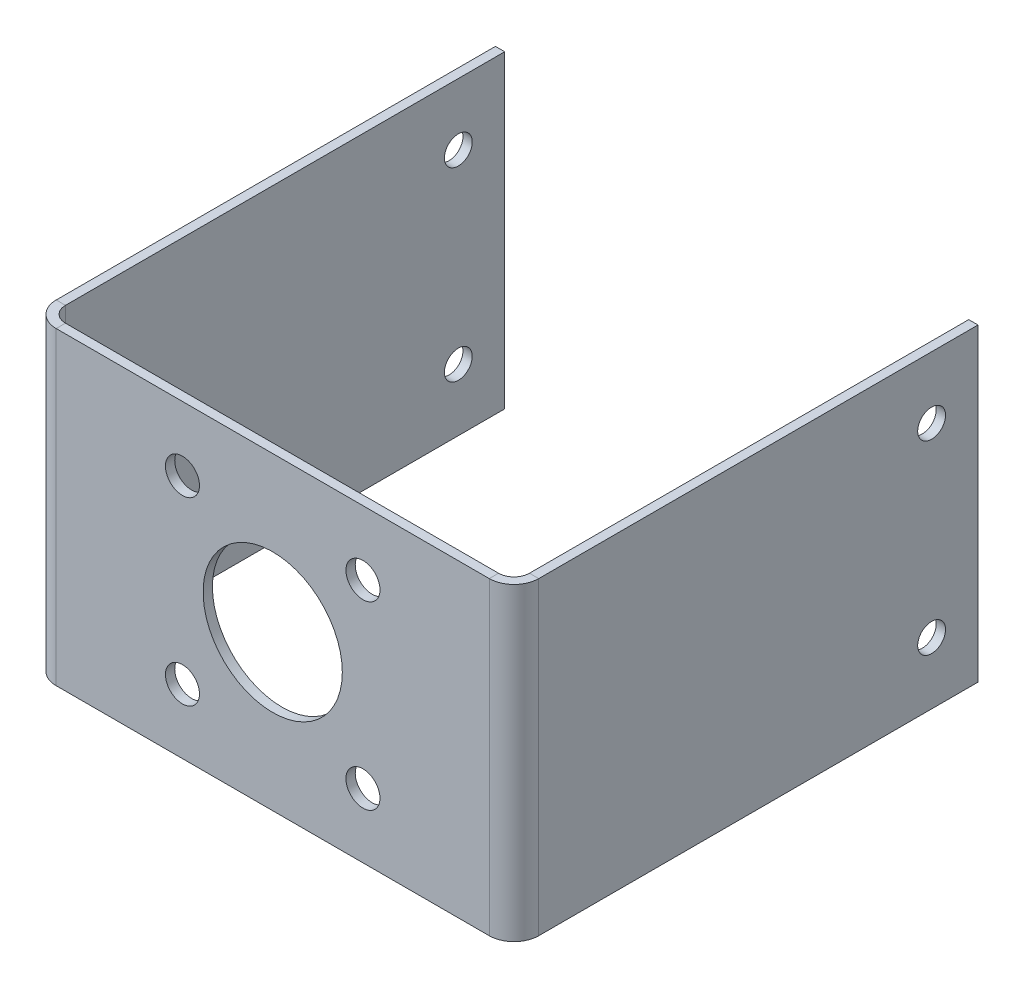
ISO-10303-21;
HEADER;
FILE_DESCRIPTION(('STEP AP214'),'2;1');
FILE_NAME('part.step','',(''),(''),'','','');
FILE_SCHEMA(('AUTOMOTIVE_DESIGN { 1 0 10303 214 1 1 1 1 }'));
ENDSEC;
DATA;
#1=APPLICATION_CONTEXT('core data for automotive mechanical design processes');
#2=APPLICATION_PROTOCOL_DEFINITION('international standard','automotive_design',2000,#1);
#3=PRODUCT_CONTEXT('',#1,'mechanical');
#4=PRODUCT('Part','Part','',(#3));
#5=PRODUCT_RELATED_PRODUCT_CATEGORY('part','',(#4));
#6=PRODUCT_DEFINITION_FORMATION('','',#4);
#7=PRODUCT_DEFINITION_CONTEXT('part definition',#1,'design');
#8=PRODUCT_DEFINITION('design','',#6,#7);
#9=PRODUCT_DEFINITION_SHAPE('','',#8);
#10=(LENGTH_UNIT() NAMED_UNIT(*) SI_UNIT(.MILLI.,.METRE.));
#11=(NAMED_UNIT(*) PLANE_ANGLE_UNIT() SI_UNIT($,.RADIAN.));
#12=(NAMED_UNIT(*) SI_UNIT($,.STERADIAN.) SOLID_ANGLE_UNIT());
#13=UNCERTAINTY_MEASURE_WITH_UNIT(LENGTH_MEASURE(1.E-05),#10,'distance_accuracy_value','');
#14=(GEOMETRIC_REPRESENTATION_CONTEXT(3) GLOBAL_UNCERTAINTY_ASSIGNED_CONTEXT((#13)) GLOBAL_UNIT_ASSIGNED_CONTEXT((#10,
#11,#12)) REPRESENTATION_CONTEXT('',''));
#15=CARTESIAN_POINT('',(0.,0.,0.));
#16=DIRECTION('',(0.,0.,1.));
#17=DIRECTION('',(1.,0.,0.));
#18=AXIS2_PLACEMENT_3D('',#15,#16,#17);
#19=CARTESIAN_POINT('',(0.,0.,-6.00000000000001));
#20=DIRECTION('',(0.,0.,-1.));
#21=DIRECTION('',(-1.,0.,0.));
#22=AXIS2_PLACEMENT_3D('',#19,#20,#21);
#23=PLANE('',#22);
#24=CARTESIAN_POINT('',(-58.3500000000002,58.3500000000005,-6.00000000000001));
#25=DIRECTION('',(0.,0.,-1.));
#26=DIRECTION('',(-1.,0.,0.));
#27=AXIS2_PLACEMENT_3D('',#24,#25,#26);
#28=CIRCLE('',#27,11.);
#29=CARTESIAN_POINT('',(-69.3500000000002,58.3500000000005,-6.00000000000001));
#30=VERTEX_POINT('',#29);
#31=EDGE_CURVE('E348',#30,#30,#28,.T.);
#32=ORIENTED_EDGE('',*,*,#31,.F.);
#33=EDGE_LOOP('',(#32));
#34=FACE_BOUND('',#33,.T.);
#35=CARTESIAN_POINT('',(-58.3500000000003,-58.35,-6.000000000002));
#36=DIRECTION('',(0.,0.,-1.));
#37=DIRECTION('',(-1.,0.,0.));
#38=AXIS2_PLACEMENT_3D('',#35,#36,#37);
#39=CIRCLE('',#38,11.);
#40=CARTESIAN_POINT('',(-69.3500000000003,-58.35,-6.000000000002));
#41=VERTEX_POINT('',#40);
#42=EDGE_CURVE('E345',#41,#41,#39,.T.);
#43=ORIENTED_EDGE('',*,*,#42,.F.);
#44=EDGE_LOOP('',(#43));
#45=FACE_BOUND('',#44,.T.);
#46=CARTESIAN_POINT('',(58.3500000000003,-58.35,-6.000000000002));
#47=DIRECTION('',(0.,0.,-1.));
#48=DIRECTION('',(-1.,0.,0.));
#49=AXIS2_PLACEMENT_3D('',#46,#47,#48);
#50=CIRCLE('',#49,11.);
#51=CARTESIAN_POINT('',(47.3500000000002,-58.35,-6.000000000002));
#52=VERTEX_POINT('',#51);
#53=EDGE_CURVE('E342',#52,#52,#50,.T.);
#54=ORIENTED_EDGE('',*,*,#53,.F.);
#55=EDGE_LOOP('',(#54));
#56=FACE_BOUND('',#55,.T.);
#57=CARTESIAN_POINT('',(58.3500000000003,58.3500000000005,-6.00000000000001));
#58=DIRECTION('',(0.,0.,-1.));
#59=DIRECTION('',(-1.,0.,0.));
#60=AXIS2_PLACEMENT_3D('',#57,#58,#59);
#61=CIRCLE('',#60,11.);
#62=CARTESIAN_POINT('',(47.3500000000003,58.3500000000005,-6.00000000000001));
#63=VERTEX_POINT('',#62);
#64=EDGE_CURVE('E339',#63,#63,#61,.T.);
#65=ORIENTED_EDGE('',*,*,#64,.F.);
#66=EDGE_LOOP('',(#65));
#67=FACE_BOUND('',#66,.T.);
#68=CARTESIAN_POINT('',(0.,0.,-6.00000000000001));
#69=DIRECTION('',(0.,0.,-1.));
#70=DIRECTION('',(-1.,0.,0.));
#71=AXIS2_PLACEMENT_3D('',#68,#69,#70);
#72=CIRCLE('',#71,45.);
#73=CARTESIAN_POINT('',(-45.0000000000002,0.,-6.00000000000001));
#74=VERTEX_POINT('',#73);
#75=EDGE_CURVE('E224',#74,#74,#72,.T.);
#76=ORIENTED_EDGE('',*,*,#75,.F.);
#77=EDGE_LOOP('',(#76));
#78=FACE_BOUND('',#77,.T.);
#79=DIRECTION('',(-1.,0.,0.));
#80=VECTOR('',#79,1.);
#81=CARTESIAN_POINT('',(-156.000000000001,100.000000000001,-6.00000000000001));
#82=LINE('',#81,#80);
#83=CARTESIAN_POINT('',(140.,100.000000000001,-6.00000000000001));
#84=VERTEX_POINT('',#83);
#85=CARTESIAN_POINT('',(-140.000000000001,100.000000000001,-6.00000000000001));
#86=VERTEX_POINT('',#85);
#87=EDGE_CURVE('E99',#84,#86,#82,.T.);
#88=ORIENTED_EDGE('',*,*,#87,.F.);
#89=DIRECTION('',(0.,-1.,0.));
#90=VECTOR('',#89,1.);
#91=CARTESIAN_POINT('',(140.000000000001,-100.000000000001,-6.000000000002));
#92=LINE('',#91,#90);
#93=CARTESIAN_POINT('',(140.000000000001,-100.,-6.000000000002));
#94=VERTEX_POINT('',#93);
#95=EDGE_CURVE('E237',#94,#84,#92,.F.);
#96=ORIENTED_EDGE('',*,*,#95,.F.);
#97=DIRECTION('',(1.,0.,0.));
#98=VECTOR('',#97,1.);
#99=CARTESIAN_POINT('',(-156.,-100.000000000001,-6.000000000002));
#100=LINE('',#99,#98);
#101=CARTESIAN_POINT('',(-140.,-100.,-6.000000000002));
#102=VERTEX_POINT('',#101);
#103=EDGE_CURVE('E15',#102,#94,#100,.T.);
#104=ORIENTED_EDGE('',*,*,#103,.F.);
#105=DIRECTION('',(0.,1.,0.));
#106=VECTOR('',#105,1.);
#107=CARTESIAN_POINT('',(-140.000000000001,100.000000000001,-6.00000000000001));
#108=LINE('',#107,#106);
#109=EDGE_CURVE('E291',#86,#102,#108,.F.);
#110=ORIENTED_EDGE('',*,*,#109,.F.);
#111=EDGE_LOOP('',(#88,#96,#104,#110));
#112=FACE_BOUND('',#111,.T.);
#113=ADVANCED_FACE('F90',(#34,#45,#56,#67,#78,#112),#23,.T.);
#114=CARTESIAN_POINT('',(0.,0.,0.));
#115=DIRECTION('',(0.,0.,-1.));
#116=DIRECTION('',(-1.,0.,0.));
#117=AXIS2_PLACEMENT_3D('',#114,#115,#116);
#118=PLANE('',#117);
#119=CARTESIAN_POINT('',(-58.3500000000002,58.3500000000005,0.));
#120=DIRECTION('',(0.,0.,1.));
#121=DIRECTION('',(1.,0.,0.));
#122=AXIS2_PLACEMENT_3D('',#119,#120,#121);
#123=CIRCLE('',#122,11.);
#124=CARTESIAN_POINT('',(-47.3500000000002,58.3500000000005,0.));
#125=VERTEX_POINT('',#124);
#126=EDGE_CURVE('E327',#125,#125,#123,.T.);
#127=ORIENTED_EDGE('',*,*,#126,.F.);
#128=EDGE_LOOP('',(#127));
#129=FACE_BOUND('',#128,.T.);
#130=CARTESIAN_POINT('',(-58.3500000000003,-58.35,-1.99840144432528E-12));
#131=DIRECTION('',(0.,0.,1.));
#132=DIRECTION('',(1.,0.,0.));
#133=AXIS2_PLACEMENT_3D('',#130,#131,#132);
#134=CIRCLE('',#133,11.);
#135=CARTESIAN_POINT('',(-47.3500000000002,-58.35,-1.99840144432528E-12));
#136=VERTEX_POINT('',#135);
#137=EDGE_CURVE('E332',#136,#136,#134,.T.);
#138=ORIENTED_EDGE('',*,*,#137,.F.);
#139=EDGE_LOOP('',(#138));
#140=FACE_BOUND('',#139,.T.);
#141=CARTESIAN_POINT('',(58.3500000000003,-58.35,-1.99840144432528E-12));
#142=DIRECTION('',(0.,0.,1.));
#143=DIRECTION('',(1.,0.,0.));
#144=AXIS2_PLACEMENT_3D('',#141,#142,#143);
#145=CIRCLE('',#144,11.);
#146=CARTESIAN_POINT('',(69.3500000000003,-58.35,-1.99840144432528E-12));
#147=VERTEX_POINT('',#146);
#148=EDGE_CURVE('E328',#147,#147,#145,.T.);
#149=ORIENTED_EDGE('',*,*,#148,.F.);
#150=EDGE_LOOP('',(#149));
#151=FACE_BOUND('',#150,.T.);
#152=CARTESIAN_POINT('',(58.3500000000003,58.3500000000005,0.));
#153=DIRECTION('',(0.,0.,1.));
#154=DIRECTION('',(1.,0.,0.));
#155=AXIS2_PLACEMENT_3D('',#152,#153,#154);
#156=CIRCLE('',#155,11.);
#157=CARTESIAN_POINT('',(69.3500000000003,58.3500000000005,0.));
#158=VERTEX_POINT('',#157);
#159=EDGE_CURVE('E331',#158,#158,#156,.T.);
#160=ORIENTED_EDGE('',*,*,#159,.F.);
#161=EDGE_LOOP('',(#160));
#162=FACE_BOUND('',#161,.T.);
#163=CARTESIAN_POINT('',(0.,0.,0.));
#164=DIRECTION('',(0.,0.,1.));
#165=DIRECTION('',(1.,0.,0.));
#166=AXIS2_PLACEMENT_3D('',#163,#164,#165);
#167=CIRCLE('',#166,45.);
#168=CARTESIAN_POINT('',(45.0000000000002,0.,0.));
#169=VERTEX_POINT('',#168);
#170=EDGE_CURVE('E351',#169,#169,#167,.T.);
#171=ORIENTED_EDGE('',*,*,#170,.F.);
#172=EDGE_LOOP('',(#171));
#173=FACE_BOUND('',#172,.T.);
#174=DIRECTION('',(0.,-1.,0.));
#175=VECTOR('',#174,1.);
#176=CARTESIAN_POINT('',(140.000000000001,-100.000000000001,-1.99840144432528E-12));
#177=LINE('',#176,#175);
#178=CARTESIAN_POINT('',(140.000000000001,-100.,-1.99840144432528E-12));
#179=VERTEX_POINT('',#178);
#180=CARTESIAN_POINT('',(140.,100.000000000001,0.));
#181=VERTEX_POINT('',#180);
#182=EDGE_CURVE('E225',#179,#181,#177,.F.);
#183=ORIENTED_EDGE('',*,*,#182,.T.);
#184=DIRECTION('',(-1.,0.,0.));
#185=VECTOR('',#184,1.);
#186=CARTESIAN_POINT('',(-156.000000000001,100.000000000001,0.));
#187=LINE('',#186,#185);
#188=CARTESIAN_POINT('',(-140.000000000001,100.,0.));
#189=VERTEX_POINT('',#188);
#190=EDGE_CURVE('E297',#181,#189,#187,.T.);
#191=ORIENTED_EDGE('',*,*,#190,.T.);
#192=DIRECTION('',(0.,1.,0.));
#193=VECTOR('',#192,1.);
#194=CARTESIAN_POINT('',(-140.000000000001,100.000000000001,0.));
#195=LINE('',#194,#193);
#196=CARTESIAN_POINT('',(-140.,-100.,-1.99840144432528E-12));
#197=VERTEX_POINT('',#196);
#198=EDGE_CURVE('E279',#189,#197,#195,.F.);
#199=ORIENTED_EDGE('',*,*,#198,.T.);
#200=DIRECTION('',(1.,0.,0.));
#201=VECTOR('',#200,1.);
#202=CARTESIAN_POINT('',(-156.,-100.000000000001,-1.99840144432528E-12));
#203=LINE('',#202,#201);
#204=EDGE_CURVE('E299',#197,#179,#203,.T.);
#205=ORIENTED_EDGE('',*,*,#204,.T.);
#206=EDGE_LOOP('',(#183,#191,#199,#205));
#207=FACE_BOUND('',#206,.T.);
#208=ADVANCED_FACE('F381',(#129,#140,#151,#162,#173,#207),#118,.F.);
#209=CARTESIAN_POINT('',(-156.,-100.000000000001,-6.000000000002));
#210=DIRECTION('',(0.,-1.,0.));
#211=DIRECTION('',(0.,0.,-1.));
#212=AXIS2_PLACEMENT_3D('',#209,#210,#211);
#213=PLANE('',#212);
#214=ORIENTED_EDGE('',*,*,#103,.T.);
#215=DIRECTION('',(0.,0.,1.));
#216=VECTOR('',#215,1.);
#217=CARTESIAN_POINT('',(140.000000000001,-100.,-6.000000000002));
#218=LINE('',#217,#216);
#219=EDGE_CURVE('E231',#94,#179,#218,.T.);
#220=ORIENTED_EDGE('',*,*,#219,.T.);
#221=ORIENTED_EDGE('',*,*,#204,.F.);
#222=DIRECTION('',(0.,0.,1.));
#223=VECTOR('',#222,1.);
#224=CARTESIAN_POINT('',(-140.,-100.,-6.000000000002));
#225=LINE('',#224,#223);
#226=EDGE_CURVE('E113',#102,#197,#225,.T.);
#227=ORIENTED_EDGE('',*,*,#226,.F.);
#228=EDGE_LOOP('',(#214,#220,#221,#227));
#229=FACE_BOUND('',#228,.T.);
#230=ADVANCED_FACE('F387',(#229),#213,.T.);
#231=CARTESIAN_POINT('',(-156.000000000001,100.000000000001,-6.00000000000001));
#232=DIRECTION('',(0.,1.,0.));
#233=DIRECTION('',(0.,0.,1.));
#234=AXIS2_PLACEMENT_3D('',#231,#232,#233);
#235=PLANE('',#234);
#236=DIRECTION('',(0.,0.,1.));
#237=VECTOR('',#236,1.);
#238=CARTESIAN_POINT('',(140.,100.000000000001,-6.00000000000001));
#239=LINE('',#238,#237);
#240=EDGE_CURVE('E243',#84,#181,#239,.T.);
#241=ORIENTED_EDGE('',*,*,#240,.F.);
#242=ORIENTED_EDGE('',*,*,#87,.T.);
#243=DIRECTION('',(0.,0.,1.));
#244=VECTOR('',#243,1.);
#245=CARTESIAN_POINT('',(-140.000000000001,100.,-6.00000000000001));
#246=LINE('',#245,#244);
#247=EDGE_CURVE('E285',#86,#189,#246,.T.);
#248=ORIENTED_EDGE('',*,*,#247,.T.);
#249=ORIENTED_EDGE('',*,*,#190,.F.);
#250=EDGE_LOOP('',(#241,#242,#248,#249));
#251=FACE_BOUND('',#250,.T.);
#252=ADVANCED_FACE('F92',(#251),#235,.T.);
#253=CARTESIAN_POINT('',(-140.,-100.,-16.000000000002));
#254=DIRECTION('',(0.,-1.,0.));
#255=DIRECTION('',(0.,0.,-1.));
#256=AXIS2_PLACEMENT_3D('',#253,#254,#255);
#257=PLANE('',#256);
#258=DIRECTION('',(1.,0.,0.));
#259=VECTOR('',#258,1.);
#260=CARTESIAN_POINT('',(-156.,-100.,-16.000000000002));
#261=LINE('',#260,#259);
#262=CARTESIAN_POINT('',(-150.,-100.,-16.000000000002));
#263=VERTEX_POINT('',#262);
#264=CARTESIAN_POINT('',(-156.,-100.,-16.000000000002));
#265=VERTEX_POINT('',#264);
#266=EDGE_CURVE('E246',#263,#265,#261,.F.);
#267=ORIENTED_EDGE('',*,*,#266,.F.);
#268=CARTESIAN_POINT('',(-140.,-100.,-16.000000000002));
#269=DIRECTION('',(0.,1.,0.));
#270=DIRECTION('',(0.,0.,1.));
#271=AXIS2_PLACEMENT_3D('',#268,#269,#270);
#272=CIRCLE('',#271,10.);
#273=EDGE_CURVE('E288',#102,#263,#272,.F.);
#274=ORIENTED_EDGE('',*,*,#273,.F.);
#275=ORIENTED_EDGE('',*,*,#226,.T.);
#276=CARTESIAN_POINT('',(-140.,-100.,-16.000000000002));
#277=DIRECTION('',(0.,1.,0.));
#278=DIRECTION('',(0.,0.,1.));
#279=AXIS2_PLACEMENT_3D('',#276,#277,#278);
#280=CIRCLE('',#279,16.);
#281=EDGE_CURVE('E281',#197,#265,#280,.F.);
#282=ORIENTED_EDGE('',*,*,#281,.T.);
#283=EDGE_LOOP('',(#267,#274,#275,#282));
#284=FACE_BOUND('',#283,.T.);
#285=ADVANCED_FACE('F399',(#284),#257,.T.);
#286=CARTESIAN_POINT('',(-140.000000000001,100.,-16.));
#287=DIRECTION('',(0.,-1.,0.));
#288=DIRECTION('',(0.,0.,-1.));
#289=AXIS2_PLACEMENT_3D('',#286,#287,#288);
#290=PLANE('',#289);
#291=CARTESIAN_POINT('',(-140.000000000001,100.,-16.));
#292=DIRECTION('',(0.,1.,0.));
#293=DIRECTION('',(0.,0.,1.));
#294=AXIS2_PLACEMENT_3D('',#291,#292,#293);
#295=CIRCLE('',#294,10.);
#296=CARTESIAN_POINT('',(-150.000000000001,100.,-16.));
#297=VERTEX_POINT('',#296);
#298=EDGE_CURVE('E252',#297,#86,#295,.T.);
#299=ORIENTED_EDGE('',*,*,#298,.F.);
#300=DIRECTION('',(1.,0.,0.));
#301=VECTOR('',#300,1.);
#302=CARTESIAN_POINT('',(-150.000000000001,100.,-16.));
#303=LINE('',#302,#301);
#304=CARTESIAN_POINT('',(-156.000000000001,100.,-16.));
#305=VERTEX_POINT('',#304);
#306=EDGE_CURVE('E272',#297,#305,#303,.F.);
#307=ORIENTED_EDGE('',*,*,#306,.T.);
#308=CARTESIAN_POINT('',(-140.000000000001,100.,-16.));
#309=DIRECTION('',(0.,1.,0.));
#310=DIRECTION('',(0.,0.,1.));
#311=AXIS2_PLACEMENT_3D('',#308,#309,#310);
#312=CIRCLE('',#311,16.);
#313=EDGE_CURVE('E282',#305,#189,#312,.T.);
#314=ORIENTED_EDGE('',*,*,#313,.T.);
#315=ORIENTED_EDGE('',*,*,#247,.F.);
#316=EDGE_LOOP('',(#299,#307,#314,#315));
#317=FACE_BOUND('',#316,.T.);
#318=ADVANCED_FACE('F393',(#317),#290,.F.);
#319=CARTESIAN_POINT('',(-140.000000000001,100.000000000001,-16.));
#320=DIRECTION('',(0.,1.,0.));
#321=DIRECTION('',(-1.,0.,0.));
#322=AXIS2_PLACEMENT_3D('',#319,#320,#321);
#323=CYLINDRICAL_SURFACE('',#322,16.);
#324=ORIENTED_EDGE('',*,*,#198,.F.);
#325=ORIENTED_EDGE('',*,*,#313,.F.);
#326=DIRECTION('',(0.,1.,0.));
#327=VECTOR('',#326,1.);
#328=CARTESIAN_POINT('',(-156.,-100.,-16.000000000002));
#329=LINE('',#328,#327);
#330=EDGE_CURVE('E270',#305,#265,#329,.F.);
#331=ORIENTED_EDGE('',*,*,#330,.T.);
#332=ORIENTED_EDGE('',*,*,#281,.F.);
#333=EDGE_LOOP('',(#324,#325,#331,#332));
#334=FACE_BOUND('',#333,.T.);
#335=ADVANCED_FACE('F438',(#334),#323,.T.);
#336=CARTESIAN_POINT('',(-140.000000000001,100.000000000001,-16.));
#337=DIRECTION('',(0.,1.,0.));
#338=DIRECTION('',(-1.,0.,0.));
#339=AXIS2_PLACEMENT_3D('',#336,#337,#338);
#340=CYLINDRICAL_SURFACE('',#339,10.);
#341=ORIENTED_EDGE('',*,*,#109,.T.);
#342=ORIENTED_EDGE('',*,*,#273,.T.);
#343=DIRECTION('',(0.,1.,0.));
#344=VECTOR('',#343,1.);
#345=CARTESIAN_POINT('',(-150.,-100.,-16.000000000002));
#346=LINE('',#345,#344);
#347=EDGE_CURVE('E275',#263,#297,#346,.T.);
#348=ORIENTED_EDGE('',*,*,#347,.T.);
#349=ORIENTED_EDGE('',*,*,#298,.T.);
#350=EDGE_LOOP('',(#341,#342,#348,#349));
#351=FACE_BOUND('',#350,.T.);
#352=ADVANCED_FACE('F405',(#351),#340,.F.);
#353=CARTESIAN_POINT('',(-156.000000000002,100.,-300.));
#354=DIRECTION('',(0.,-1.,0.));
#355=DIRECTION('',(0.,0.,-1.));
#356=AXIS2_PLACEMENT_3D('',#353,#354,#355);
#357=PLANE('',#356);
#358=ORIENTED_EDGE('',*,*,#306,.F.);
#359=DIRECTION('',(0.,0.,1.));
#360=VECTOR('',#359,1.);
#361=CARTESIAN_POINT('',(-150.000000000002,100.,-300.));
#362=LINE('',#361,#360);
#363=CARTESIAN_POINT('',(-150.000000000002,100.,-300.));
#364=VERTEX_POINT('',#363);
#365=EDGE_CURVE('E268',#297,#364,#362,.F.);
#366=ORIENTED_EDGE('',*,*,#365,.T.);
#367=DIRECTION('',(1.,0.,0.));
#368=VECTOR('',#367,1.);
#369=CARTESIAN_POINT('',(-156.000000000002,100.,-300.));
#370=LINE('',#369,#368);
#371=CARTESIAN_POINT('',(-156.000000000002,100.,-300.));
#372=VERTEX_POINT('',#371);
#373=EDGE_CURVE('E249',#372,#364,#370,.T.);
#374=ORIENTED_EDGE('',*,*,#373,.F.);
#375=DIRECTION('',(0.,0.,-1.));
#376=VECTOR('',#375,1.);
#377=CARTESIAN_POINT('',(-156.000000000001,100.000000000001,4.44089209850063E-13));
#378=LINE('',#377,#376);
#379=EDGE_CURVE('E261',#305,#372,#378,.T.);
#380=ORIENTED_EDGE('',*,*,#379,.F.);
#381=EDGE_LOOP('',(#358,#366,#374,#380));
#382=FACE_BOUND('',#381,.T.);
#383=ADVANCED_FACE('F430',(#382),#357,.F.);
#384=CARTESIAN_POINT('',(-156.,-100.000000000001,-6.000000000002));
#385=DIRECTION('',(0.,1.,0.));
#386=DIRECTION('',(0.,0.,1.));
#387=AXIS2_PLACEMENT_3D('',#384,#385,#386);
#388=PLANE('',#387);
#389=ORIENTED_EDGE('',*,*,#266,.T.);
#390=DIRECTION('',(0.,0.,1.));
#391=VECTOR('',#390,1.);
#392=CARTESIAN_POINT('',(-156.,-100.000000000001,-1.33226762955019E-12));
#393=LINE('',#392,#391);
#394=CARTESIAN_POINT('',(-156.000000000001,-100.,-300.000000000002));
#395=VERTEX_POINT('',#394);
#396=EDGE_CURVE('E256',#395,#265,#393,.T.);
#397=ORIENTED_EDGE('',*,*,#396,.F.);
#398=DIRECTION('',(1.,0.,0.));
#399=VECTOR('',#398,1.);
#400=CARTESIAN_POINT('',(-156.000000000001,-100.,-300.000000000002));
#401=LINE('',#400,#399);
#402=CARTESIAN_POINT('',(-150.000000000001,-100.,-300.000000000002));
#403=VERTEX_POINT('',#402);
#404=EDGE_CURVE('E253',#395,#403,#401,.T.);
#405=ORIENTED_EDGE('',*,*,#404,.T.);
#406=DIRECTION('',(0.,0.,-1.));
#407=VECTOR('',#406,1.);
#408=CARTESIAN_POINT('',(-150.,-100.,-6.000000000002));
#409=LINE('',#408,#407);
#410=EDGE_CURVE('E263',#403,#263,#409,.F.);
#411=ORIENTED_EDGE('',*,*,#410,.T.);
#412=EDGE_LOOP('',(#389,#397,#405,#411));
#413=FACE_BOUND('',#412,.T.);
#414=ADVANCED_FACE('F412',(#413),#388,.F.);
#415=CARTESIAN_POINT('',(-156.000000000001,0.,4.44089209850063E-13));
#416=DIRECTION('',(1.,0.,0.));
#417=DIRECTION('',(0.,0.,-1.));
#418=AXIS2_PLACEMENT_3D('',#415,#416,#417);
#419=PLANE('',#418);
#420=CARTESIAN_POINT('',(-156.000000000001,60.,-270.));
#421=DIRECTION('',(-1.,0.,0.));
#422=DIRECTION('',(0.,0.,1.));
#423=AXIS2_PLACEMENT_3D('',#420,#421,#422);
#424=CIRCLE('',#423,8.99999999999998);
#425=CARTESIAN_POINT('',(-156.000000000001,60.,-261.));
#426=VERTEX_POINT('',#425);
#427=EDGE_CURVE('E311',#426,#426,#424,.T.);
#428=ORIENTED_EDGE('',*,*,#427,.F.);
#429=EDGE_LOOP('',(#428));
#430=FACE_BOUND('',#429,.T.);
#431=CARTESIAN_POINT('',(-156.000000000001,-60.0000000000005,-270.000000000002));
#432=DIRECTION('',(-1.,0.,0.));
#433=DIRECTION('',(0.,0.,1.));
#434=AXIS2_PLACEMENT_3D('',#431,#432,#433);
#435=CIRCLE('',#434,8.99999999999998);
#436=CARTESIAN_POINT('',(-156.000000000001,-60.0000000000005,-261.000000000002));
#437=VERTEX_POINT('',#436);
#438=EDGE_CURVE('E321',#437,#437,#435,.T.);
#439=ORIENTED_EDGE('',*,*,#438,.F.);
#440=EDGE_LOOP('',(#439));
#441=FACE_BOUND('',#440,.T.);
#442=ORIENTED_EDGE('',*,*,#330,.F.);
#443=ORIENTED_EDGE('',*,*,#379,.T.);
#444=DIRECTION('',(0.,-1.,0.));
#445=VECTOR('',#444,1.);
#446=CARTESIAN_POINT('',(-156.000000000002,0.,-300.));
#447=LINE('',#446,#445);
#448=EDGE_CURVE('E259',#372,#395,#447,.T.);
#449=ORIENTED_EDGE('',*,*,#448,.T.);
#450=ORIENTED_EDGE('',*,*,#396,.T.);
#451=EDGE_LOOP('',(#442,#443,#449,#450));
#452=FACE_BOUND('',#451,.T.);
#453=ADVANCED_FACE('F416',(#430,#441,#452),#419,.F.);
#454=CARTESIAN_POINT('',(-150.,0.,4.44089209850063E-13));
#455=DIRECTION('',(1.,0.,0.));
#456=DIRECTION('',(0.,0.,-1.));
#457=AXIS2_PLACEMENT_3D('',#454,#455,#456);
#458=PLANE('',#457);
#459=CARTESIAN_POINT('',(-150.000000000001,60.,-270.));
#460=DIRECTION('',(1.,0.,0.));
#461=DIRECTION('',(0.,0.,-1.));
#462=AXIS2_PLACEMENT_3D('',#459,#460,#461);
#463=CIRCLE('',#462,8.99999999999998);
#464=CARTESIAN_POINT('',(-150.000000000001,60.,-279.));
#465=VERTEX_POINT('',#464);
#466=EDGE_CURVE('E324',#465,#465,#463,.T.);
#467=ORIENTED_EDGE('',*,*,#466,.F.);
#468=EDGE_LOOP('',(#467));
#469=FACE_BOUND('',#468,.T.);
#470=CARTESIAN_POINT('',(-150.000000000001,-60.0000000000005,-270.000000000002));
#471=DIRECTION('',(1.,0.,0.));
#472=DIRECTION('',(0.,0.,-1.));
#473=AXIS2_PLACEMENT_3D('',#470,#471,#472);
#474=CIRCLE('',#473,8.99999999999998);
#475=CARTESIAN_POINT('',(-150.000000000001,-60.0000000000005,-279.000000000002));
#476=VERTEX_POINT('',#475);
#477=EDGE_CURVE('E304',#476,#476,#474,.T.);
#478=ORIENTED_EDGE('',*,*,#477,.F.);
#479=EDGE_LOOP('',(#478));
#480=FACE_BOUND('',#479,.T.);
#481=ORIENTED_EDGE('',*,*,#365,.F.);
#482=ORIENTED_EDGE('',*,*,#347,.F.);
#483=ORIENTED_EDGE('',*,*,#410,.F.);
#484=DIRECTION('',(0.,1.,0.));
#485=VECTOR('',#484,1.);
#486=CARTESIAN_POINT('',(-150.000000000001,-100.,-300.000000000002));
#487=LINE('',#486,#485);
#488=EDGE_CURVE('E266',#364,#403,#487,.F.);
#489=ORIENTED_EDGE('',*,*,#488,.F.);
#490=EDGE_LOOP('',(#481,#482,#483,#489));
#491=FACE_BOUND('',#490,.T.);
#492=ADVANCED_FACE('F426',(#469,#480,#491),#458,.T.);
#493=CARTESIAN_POINT('',(-156.000000000001,-100.,-300.000000000002));
#494=DIRECTION('',(0.,0.,1.));
#495=DIRECTION('',(1.,0.,0.));
#496=AXIS2_PLACEMENT_3D('',#493,#494,#495);
#497=PLANE('',#496);
#498=ORIENTED_EDGE('',*,*,#488,.T.);
#499=ORIENTED_EDGE('',*,*,#404,.F.);
#500=ORIENTED_EDGE('',*,*,#448,.F.);
#501=ORIENTED_EDGE('',*,*,#373,.T.);
#502=EDGE_LOOP('',(#498,#499,#500,#501));
#503=FACE_BOUND('',#502,.T.);
#504=ADVANCED_FACE('F422',(#503),#497,.F.);
#505=CARTESIAN_POINT('',(140.,100.000000000001,-16.));
#506=DIRECTION('',(0.,1.,0.));
#507=DIRECTION('',(0.,0.,1.));
#508=AXIS2_PLACEMENT_3D('',#505,#506,#507);
#509=PLANE('',#508);
#510=DIRECTION('',(-1.,0.,0.));
#511=VECTOR('',#510,1.);
#512=CARTESIAN_POINT('',(156.000000000001,100.000000000001,-16.));
#513=LINE('',#512,#511);
#514=CARTESIAN_POINT('',(150.,100.000000000001,-16.));
#515=VERTEX_POINT('',#514);
#516=CARTESIAN_POINT('',(156.000000000001,100.000000000001,-16.));
#517=VERTEX_POINT('',#516);
#518=EDGE_CURVE('E206',#515,#517,#513,.F.);
#519=ORIENTED_EDGE('',*,*,#518,.F.);
#520=CARTESIAN_POINT('',(140.,100.000000000001,-16.));
#521=DIRECTION('',(0.,-1.,0.));
#522=DIRECTION('',(0.,0.,-1.));
#523=AXIS2_PLACEMENT_3D('',#520,#521,#522);
#524=CIRCLE('',#523,10.);
#525=EDGE_CURVE('E234',#84,#515,#524,.F.);
#526=ORIENTED_EDGE('',*,*,#525,.F.);
#527=ORIENTED_EDGE('',*,*,#240,.T.);
#528=CARTESIAN_POINT('',(140.,100.000000000001,-16.));
#529=DIRECTION('',(0.,-1.,0.));
#530=DIRECTION('',(0.,0.,-1.));
#531=AXIS2_PLACEMENT_3D('',#528,#529,#530);
#532=CIRCLE('',#531,16.);
#533=EDGE_CURVE('E227',#181,#517,#532,.F.);
#534=ORIENTED_EDGE('',*,*,#533,.T.);
#535=EDGE_LOOP('',(#519,#526,#527,#534));
#536=FACE_BOUND('',#535,.T.);
#537=ADVANCED_FACE('F498',(#536),#509,.T.);
#538=CARTESIAN_POINT('',(140.000000000001,-100.,-16.000000000002));
#539=DIRECTION('',(0.,1.,0.));
#540=DIRECTION('',(0.,0.,1.));
#541=AXIS2_PLACEMENT_3D('',#538,#539,#540);
#542=PLANE('',#541);
#543=CARTESIAN_POINT('',(140.000000000001,-100.,-16.000000000002));
#544=DIRECTION('',(0.,-1.,0.));
#545=DIRECTION('',(0.,0.,-1.));
#546=AXIS2_PLACEMENT_3D('',#543,#544,#545);
#547=CIRCLE('',#546,10.);
#548=CARTESIAN_POINT('',(150.000000000001,-100.,-16.000000000002));
#549=VERTEX_POINT('',#548);
#550=EDGE_CURVE('E240',#549,#94,#547,.T.);
#551=ORIENTED_EDGE('',*,*,#550,.F.);
#552=DIRECTION('',(-1.,0.,0.));
#553=VECTOR('',#552,1.);
#554=CARTESIAN_POINT('',(150.000000000001,-100.,-16.000000000002));
#555=LINE('',#554,#553);
#556=CARTESIAN_POINT('',(156.000000000001,-100.,-16.0000000000018));
#557=VERTEX_POINT('',#556);
#558=EDGE_CURVE('E218',#549,#557,#555,.F.);
#559=ORIENTED_EDGE('',*,*,#558,.T.);
#560=CARTESIAN_POINT('',(140.000000000001,-100.,-16.000000000002));
#561=DIRECTION('',(0.,-1.,0.));
#562=DIRECTION('',(0.,0.,-1.));
#563=AXIS2_PLACEMENT_3D('',#560,#561,#562);
#564=CIRCLE('',#563,16.);
#565=EDGE_CURVE('E228',#557,#179,#564,.T.);
#566=ORIENTED_EDGE('',*,*,#565,.T.);
#567=ORIENTED_EDGE('',*,*,#219,.F.);
#568=EDGE_LOOP('',(#551,#559,#566,#567));
#569=FACE_BOUND('',#568,.T.);
#570=ADVANCED_FACE('F367',(#569),#542,.F.);
#571=CARTESIAN_POINT('',(140.000000000001,-100.000000000001,-16.000000000002));
#572=DIRECTION('',(0.,-1.,0.));
#573=DIRECTION('',(1.,0.,0.));
#574=AXIS2_PLACEMENT_3D('',#571,#572,#573);
#575=CYLINDRICAL_SURFACE('',#574,16.);
#576=ORIENTED_EDGE('',*,*,#182,.F.);
#577=ORIENTED_EDGE('',*,*,#565,.F.);
#578=DIRECTION('',(0.,-1.,0.));
#579=VECTOR('',#578,1.);
#580=CARTESIAN_POINT('',(156.000000000001,100.000000000001,-16.));
#581=LINE('',#580,#579);
#582=EDGE_CURVE('E216',#557,#517,#581,.F.);
#583=ORIENTED_EDGE('',*,*,#582,.T.);
#584=ORIENTED_EDGE('',*,*,#533,.F.);
#585=EDGE_LOOP('',(#576,#577,#583,#584));
#586=FACE_BOUND('',#585,.T.);
#587=ADVANCED_FACE('F376',(#586),#575,.T.);
#588=CARTESIAN_POINT('',(140.000000000001,-100.000000000001,-16.000000000002));
#589=DIRECTION('',(0.,-1.,0.));
#590=DIRECTION('',(1.,0.,0.));
#591=AXIS2_PLACEMENT_3D('',#588,#589,#590);
#592=CYLINDRICAL_SURFACE('',#591,10.);
#593=ORIENTED_EDGE('',*,*,#95,.T.);
#594=ORIENTED_EDGE('',*,*,#525,.T.);
#595=DIRECTION('',(0.,-1.,0.));
#596=VECTOR('',#595,1.);
#597=CARTESIAN_POINT('',(150.,100.000000000001,-16.));
#598=LINE('',#597,#596);
#599=EDGE_CURVE('E221',#515,#549,#598,.T.);
#600=ORIENTED_EDGE('',*,*,#599,.T.);
#601=ORIENTED_EDGE('',*,*,#550,.T.);
#602=EDGE_LOOP('',(#593,#594,#600,#601));
#603=FACE_BOUND('',#602,.T.);
#604=ADVANCED_FACE('F362',(#603),#592,.F.);
#605=CARTESIAN_POINT('',(156.000000000002,-100.,-300.000000000002));
#606=DIRECTION('',(0.,1.,0.));
#607=DIRECTION('',(0.,0.,1.));
#608=AXIS2_PLACEMENT_3D('',#605,#606,#607);
#609=PLANE('',#608);
#610=ORIENTED_EDGE('',*,*,#558,.F.);
#611=DIRECTION('',(0.,0.,1.));
#612=VECTOR('',#611,1.);
#613=CARTESIAN_POINT('',(150.000000000002,-100.,-300.000000000002));
#614=LINE('',#613,#612);
#615=CARTESIAN_POINT('',(150.000000000002,-100.,-300.000000000002));
#616=VERTEX_POINT('',#615);
#617=EDGE_CURVE('E214',#549,#616,#614,.F.);
#618=ORIENTED_EDGE('',*,*,#617,.T.);
#619=DIRECTION('',(-1.,0.,0.));
#620=VECTOR('',#619,1.);
#621=CARTESIAN_POINT('',(156.000000000002,-100.,-300.000000000002));
#622=LINE('',#621,#620);
#623=CARTESIAN_POINT('',(156.000000000002,-100.,-300.000000000002));
#624=VERTEX_POINT('',#623);
#625=EDGE_CURVE('E202',#624,#616,#622,.T.);
#626=ORIENTED_EDGE('',*,*,#625,.F.);
#627=DIRECTION('',(0.,0.,-1.));
#628=VECTOR('',#627,1.);
#629=CARTESIAN_POINT('',(156.000000000001,-100.000000000001,-1.33226762955019E-12));
#630=LINE('',#629,#628);
#631=EDGE_CURVE('E189',#557,#624,#630,.T.);
#632=ORIENTED_EDGE('',*,*,#631,.F.);
#633=EDGE_LOOP('',(#610,#618,#626,#632));
#634=FACE_BOUND('',#633,.T.);
#635=ADVANCED_FACE('F368',(#634),#609,.F.);
#636=CARTESIAN_POINT('',(156.,100.000000000001,-6.00000000000001));
#637=DIRECTION('',(0.,-1.,0.));
#638=DIRECTION('',(0.,0.,-1.));
#639=AXIS2_PLACEMENT_3D('',#636,#637,#638);
#640=PLANE('',#639);
#641=ORIENTED_EDGE('',*,*,#518,.T.);
#642=DIRECTION('',(0.,0.,1.));
#643=VECTOR('',#642,1.);
#644=CARTESIAN_POINT('',(156.,100.000000000001,4.44089209850063E-13));
#645=LINE('',#644,#643);
#646=CARTESIAN_POINT('',(156.000000000002,100.000000000001,-300.));
#647=VERTEX_POINT('',#646);
#648=EDGE_CURVE('E187',#647,#517,#645,.T.);
#649=ORIENTED_EDGE('',*,*,#648,.F.);
#650=DIRECTION('',(-1.,0.,0.));
#651=VECTOR('',#650,1.);
#652=CARTESIAN_POINT('',(156.000000000002,100.000000000001,-300.));
#653=LINE('',#652,#651);
#654=CARTESIAN_POINT('',(150.000000000002,100.000000000001,-300.));
#655=VERTEX_POINT('',#654);
#656=EDGE_CURVE('E195',#647,#655,#653,.T.);
#657=ORIENTED_EDGE('',*,*,#656,.T.);
#658=DIRECTION('',(0.,0.,-1.));
#659=VECTOR('',#658,1.);
#660=CARTESIAN_POINT('',(150.,100.000000000001,-6.00000000000001));
#661=LINE('',#660,#659);
#662=EDGE_CURVE('E211',#655,#515,#661,.F.);
#663=ORIENTED_EDGE('',*,*,#662,.T.);
#664=EDGE_LOOP('',(#641,#649,#657,#663));
#665=FACE_BOUND('',#664,.T.);
#666=ADVANCED_FACE('F205',(#665),#640,.F.);
#667=CARTESIAN_POINT('',(156.,0.,6.66133814775094E-13));
#668=DIRECTION('',(-1.,0.,0.));
#669=DIRECTION('',(0.,0.,1.));
#670=AXIS2_PLACEMENT_3D('',#667,#668,#669);
#671=PLANE('',#670);
#672=CARTESIAN_POINT('',(156.000000000002,60.0000000000005,-270.000000000001));
#673=DIRECTION('',(-1.,0.,0.));
#674=DIRECTION('',(0.,0.,1.));
#675=AXIS2_PLACEMENT_3D('',#672,#673,#674);
#676=CIRCLE('',#675,8.99999999999998);
#677=CARTESIAN_POINT('',(156.000000000002,60.0000000000005,-261.000000000001));
#678=VERTEX_POINT('',#677);
#679=EDGE_CURVE('E305',#678,#678,#676,.T.);
#680=ORIENTED_EDGE('',*,*,#679,.T.);
#681=EDGE_LOOP('',(#680));
#682=FACE_BOUND('',#681,.T.);
#683=CARTESIAN_POINT('',(156.000000000002,-60.0000000000001,-270.000000000003));
#684=DIRECTION('',(-1.,0.,0.));
#685=DIRECTION('',(0.,0.,1.));
#686=AXIS2_PLACEMENT_3D('',#683,#684,#685);
#687=CIRCLE('',#686,8.99999999999998);
#688=CARTESIAN_POINT('',(156.000000000002,-60.0000000000001,-261.000000000003));
#689=VERTEX_POINT('',#688);
#690=EDGE_CURVE('E316',#689,#689,#687,.T.);
#691=ORIENTED_EDGE('',*,*,#690,.T.);
#692=EDGE_LOOP('',(#691));
#693=FACE_BOUND('',#692,.T.);
#694=ORIENTED_EDGE('',*,*,#582,.F.);
#695=ORIENTED_EDGE('',*,*,#631,.T.);
#696=DIRECTION('',(0.,1.,0.));
#697=VECTOR('',#696,1.);
#698=CARTESIAN_POINT('',(156.000000000002,4.9960036108132E-13,-300.));
#699=LINE('',#698,#697);
#700=EDGE_CURVE('E182',#624,#647,#699,.T.);
#701=ORIENTED_EDGE('',*,*,#700,.T.);
#702=ORIENTED_EDGE('',*,*,#648,.T.);
#703=EDGE_LOOP('',(#694,#695,#701,#702));
#704=FACE_BOUND('',#703,.T.);
#705=ADVANCED_FACE('F185',(#682,#693,#704),#671,.F.);
#706=CARTESIAN_POINT('',(150.,0.,6.66133814775094E-13));
#707=DIRECTION('',(-1.,0.,0.));
#708=DIRECTION('',(0.,0.,1.));
#709=AXIS2_PLACEMENT_3D('',#706,#707,#708);
#710=PLANE('',#709);
#711=CARTESIAN_POINT('',(150.000000000002,60.0000000000005,-270.000000000001));
#712=DIRECTION('',(-1.,0.,0.));
#713=DIRECTION('',(0.,0.,1.));
#714=AXIS2_PLACEMENT_3D('',#711,#712,#713);
#715=CIRCLE('',#714,8.99999999999998);
#716=CARTESIAN_POINT('',(150.000000000002,60.0000000000005,-261.000000000001));
#717=VERTEX_POINT('',#716);
#718=EDGE_CURVE('E94',#717,#717,#715,.T.);
#719=ORIENTED_EDGE('',*,*,#718,.F.);
#720=EDGE_LOOP('',(#719));
#721=FACE_BOUND('',#720,.T.);
#722=CARTESIAN_POINT('',(150.000000000001,-60.0000000000001,-270.000000000003));
#723=DIRECTION('',(-1.,0.,0.));
#724=DIRECTION('',(0.,0.,1.));
#725=AXIS2_PLACEMENT_3D('',#722,#723,#724);
#726=CIRCLE('',#725,8.99999999999998);
#727=CARTESIAN_POINT('',(150.000000000001,-60.0000000000001,-261.000000000003));
#728=VERTEX_POINT('',#727);
#729=EDGE_CURVE('E302',#728,#728,#726,.T.);
#730=ORIENTED_EDGE('',*,*,#729,.F.);
#731=EDGE_LOOP('',(#730));
#732=FACE_BOUND('',#731,.T.);
#733=ORIENTED_EDGE('',*,*,#617,.F.);
#734=ORIENTED_EDGE('',*,*,#599,.F.);
#735=ORIENTED_EDGE('',*,*,#662,.F.);
#736=DIRECTION('',(0.,-1.,0.));
#737=VECTOR('',#736,1.);
#738=CARTESIAN_POINT('',(150.000000000002,100.000000000001,-300.));
#739=LINE('',#738,#737);
#740=EDGE_CURVE('E198',#616,#655,#739,.F.);
#741=ORIENTED_EDGE('',*,*,#740,.F.);
#742=EDGE_LOOP('',(#733,#734,#735,#741));
#743=FACE_BOUND('',#742,.T.);
#744=ADVANCED_FACE('F358',(#721,#732,#743),#710,.T.);
#745=CARTESIAN_POINT('',(156.000000000002,100.000000000001,-300.));
#746=DIRECTION('',(0.,0.,1.));
#747=DIRECTION('',(1.,0.,0.));
#748=AXIS2_PLACEMENT_3D('',#745,#746,#747);
#749=PLANE('',#748);
#750=ORIENTED_EDGE('',*,*,#740,.T.);
#751=ORIENTED_EDGE('',*,*,#656,.F.);
#752=ORIENTED_EDGE('',*,*,#700,.F.);
#753=ORIENTED_EDGE('',*,*,#625,.T.);
#754=EDGE_LOOP('',(#750,#751,#752,#753));
#755=FACE_BOUND('',#754,.T.);
#756=ADVANCED_FACE('F196',(#755),#749,.F.);
#757=CARTESIAN_POINT('',(0.,0.,-10.));
#758=DIRECTION('',(0.,0.,1.));
#759=DIRECTION('',(1.,0.,0.));
#760=AXIS2_PLACEMENT_3D('',#757,#758,#759);
#761=CYLINDRICAL_SURFACE('',#760,45.);
#762=ORIENTED_EDGE('',*,*,#75,.T.);
#763=EDGE_LOOP('',(#762));
#764=FACE_BOUND('',#763,.T.);
#765=ORIENTED_EDGE('',*,*,#170,.T.);
#766=EDGE_LOOP('',(#765));
#767=FACE_BOUND('',#766,.T.);
#768=ADVANCED_FACE('F578',(#764,#767),#761,.F.);
#769=CARTESIAN_POINT('',(58.3500000000003,58.3500000000005,-10.));
#770=DIRECTION('',(0.,0.,1.));
#771=DIRECTION('',(1.,0.,0.));
#772=AXIS2_PLACEMENT_3D('',#769,#770,#771);
#773=CYLINDRICAL_SURFACE('',#772,11.);
#774=ORIENTED_EDGE('',*,*,#64,.T.);
#775=EDGE_LOOP('',(#774));
#776=FACE_BOUND('',#775,.T.);
#777=ORIENTED_EDGE('',*,*,#159,.T.);
#778=EDGE_LOOP('',(#777));
#779=FACE_BOUND('',#778,.T.);
#780=ADVANCED_FACE('F586',(#776,#779),#773,.F.);
#781=CARTESIAN_POINT('',(58.3500000000003,-58.35,-10.000000000002));
#782=DIRECTION('',(0.,0.,1.));
#783=DIRECTION('',(1.,0.,0.));
#784=AXIS2_PLACEMENT_3D('',#781,#782,#783);
#785=CYLINDRICAL_SURFACE('',#784,11.);
#786=ORIENTED_EDGE('',*,*,#53,.T.);
#787=EDGE_LOOP('',(#786));
#788=FACE_BOUND('',#787,.T.);
#789=ORIENTED_EDGE('',*,*,#148,.T.);
#790=EDGE_LOOP('',(#789));
#791=FACE_BOUND('',#790,.T.);
#792=ADVANCED_FACE('F596',(#788,#791),#785,.F.);
#793=CARTESIAN_POINT('',(-58.3500000000003,-58.35,-10.000000000002));
#794=DIRECTION('',(0.,0.,1.));
#795=DIRECTION('',(1.,0.,0.));
#796=AXIS2_PLACEMENT_3D('',#793,#794,#795);
#797=CYLINDRICAL_SURFACE('',#796,11.);
#798=ORIENTED_EDGE('',*,*,#42,.T.);
#799=EDGE_LOOP('',(#798));
#800=FACE_BOUND('',#799,.T.);
#801=ORIENTED_EDGE('',*,*,#137,.T.);
#802=EDGE_LOOP('',(#801));
#803=FACE_BOUND('',#802,.T.);
#804=ADVANCED_FACE('F606',(#800,#803),#797,.F.);
#805=CARTESIAN_POINT('',(-58.3500000000003,58.3500000000005,-10.));
#806=DIRECTION('',(0.,0.,1.));
#807=DIRECTION('',(1.,0.,0.));
#808=AXIS2_PLACEMENT_3D('',#805,#806,#807);
#809=CYLINDRICAL_SURFACE('',#808,11.);
#810=ORIENTED_EDGE('',*,*,#31,.T.);
#811=EDGE_LOOP('',(#810));
#812=FACE_BOUND('',#811,.T.);
#813=ORIENTED_EDGE('',*,*,#126,.T.);
#814=EDGE_LOOP('',(#813));
#815=FACE_BOUND('',#814,.T.);
#816=ADVANCED_FACE('F616',(#812,#815),#809,.F.);
#817=CARTESIAN_POINT('',(156.000000000002,-60.0000000000001,-270.000000000003));
#818=DIRECTION('',(-1.,0.,0.));
#819=DIRECTION('',(0.,0.,1.));
#820=AXIS2_PLACEMENT_3D('',#817,#818,#819);
#821=CYLINDRICAL_SURFACE('',#820,8.99999999999998);
#822=ORIENTED_EDGE('',*,*,#729,.T.);
#823=EDGE_LOOP('',(#822));
#824=FACE_BOUND('',#823,.T.);
#825=ORIENTED_EDGE('',*,*,#690,.F.);
#826=EDGE_LOOP('',(#825));
#827=FACE_BOUND('',#826,.T.);
#828=ADVANCED_FACE('F626',(#824,#827),#821,.F.);
#829=CARTESIAN_POINT('',(156.000000000002,60.0000000000005,-270.000000000001));
#830=DIRECTION('',(-1.,0.,0.));
#831=DIRECTION('',(0.,0.,1.));
#832=AXIS2_PLACEMENT_3D('',#829,#830,#831);
#833=CYLINDRICAL_SURFACE('',#832,8.99999999999998);
#834=ORIENTED_EDGE('',*,*,#718,.T.);
#835=EDGE_LOOP('',(#834));
#836=FACE_BOUND('',#835,.T.);
#837=ORIENTED_EDGE('',*,*,#679,.F.);
#838=EDGE_LOOP('',(#837));
#839=FACE_BOUND('',#838,.T.);
#840=ADVANCED_FACE('F636',(#836,#839),#833,.F.);
#841=ORIENTED_EDGE('',*,*,#477,.T.);
#842=EDGE_LOOP('',(#841));
#843=FACE_BOUND('',#842,.T.);
#844=ORIENTED_EDGE('',*,*,#438,.T.);
#845=EDGE_LOOP('',(#844));
#846=FACE_BOUND('',#845,.T.);
#847=ADVANCED_FACE('F638',(#843,#846),#821,.F.);
#848=ORIENTED_EDGE('',*,*,#466,.T.);
#849=EDGE_LOOP('',(#848));
#850=FACE_BOUND('',#849,.T.);
#851=ORIENTED_EDGE('',*,*,#427,.T.);
#852=EDGE_LOOP('',(#851));
#853=FACE_BOUND('',#852,.T.);
#854=ADVANCED_FACE('F648',(#850,#853),#833,.F.);
#855=CLOSED_SHELL('',(#113,#208,#230,#252,#285,#318,#335,#352,#383,#414,#453,#492,#504,#537,
#570,#587,#604,#635,#666,#705,#744,#756,#768,#780,#792,#804,#816,#828,#840,#847,#854));
#856=MANIFOLD_SOLID_BREP('B2',#855);
#857=ADVANCED_BREP_SHAPE_REPRESENTATION('',(#18,#856),#14);
#858=SHAPE_DEFINITION_REPRESENTATION(#9,#857);
ENDSEC;
END-ISO-10303-21;
